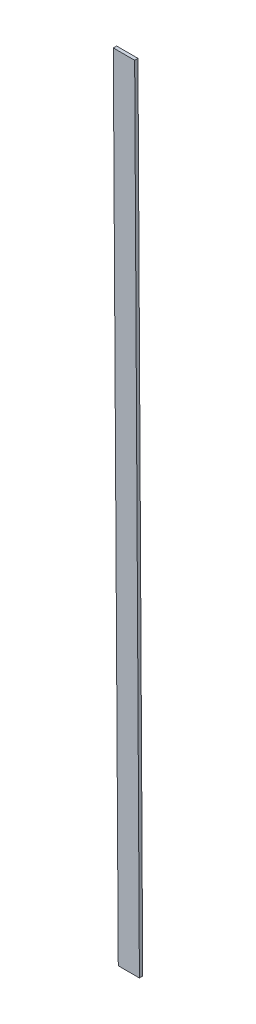
ISO-10303-21;
HEADER;
FILE_DESCRIPTION(('STEP AP214'),'2;1');
FILE_NAME('part.step','',(''),(''),'','','');
FILE_SCHEMA(('AUTOMOTIVE_DESIGN { 1 0 10303 214 1 1 1 1 }'));
ENDSEC;
DATA;
#1=APPLICATION_CONTEXT('core data for automotive mechanical design processes');
#2=APPLICATION_PROTOCOL_DEFINITION('international standard','automotive_design',2000,#1);
#3=PRODUCT_CONTEXT('',#1,'mechanical');
#4=PRODUCT('Part','Part','',(#3));
#5=PRODUCT_RELATED_PRODUCT_CATEGORY('part','',(#4));
#6=PRODUCT_DEFINITION_FORMATION('','',#4);
#7=PRODUCT_DEFINITION_CONTEXT('part definition',#1,'design');
#8=PRODUCT_DEFINITION('design','',#6,#7);
#9=PRODUCT_DEFINITION_SHAPE('','',#8);
#10=(LENGTH_UNIT() NAMED_UNIT(*) SI_UNIT(.MILLI.,.METRE.));
#11=(NAMED_UNIT(*) PLANE_ANGLE_UNIT() SI_UNIT($,.RADIAN.));
#12=(NAMED_UNIT(*) SI_UNIT($,.STERADIAN.) SOLID_ANGLE_UNIT());
#13=UNCERTAINTY_MEASURE_WITH_UNIT(LENGTH_MEASURE(1.E-05),#10,'distance_accuracy_value','');
#14=(GEOMETRIC_REPRESENTATION_CONTEXT(3) GLOBAL_UNCERTAINTY_ASSIGNED_CONTEXT((#13)) GLOBAL_UNIT_ASSIGNED_CONTEXT((#10,
#11,#12)) REPRESENTATION_CONTEXT('',''));
#15=CARTESIAN_POINT('',(0.,0.,0.));
#16=DIRECTION('',(0.,0.,1.));
#17=DIRECTION('',(1.,0.,0.));
#18=AXIS2_PLACEMENT_3D('',#15,#16,#17);
#19=CARTESIAN_POINT('',(47.7982863284493,292.660937796031,1.5875));
#20=DIRECTION('',(0.999980312138498,0.00627497692367997,0.));
#21=DIRECTION('',(-0.00627497692367997,0.999980312138498,0.));
#22=AXIS2_PLACEMENT_3D('',#19,#20,#21);
#23=PLANE('',#22);
#24=DIRECTION('',(0.00627497692367997,-0.999980312138498,0.));
#25=VECTOR('',#24,1.);
#26=CARTESIAN_POINT('',(47.7982863284493,292.660937796031,0.));
#27=LINE('',#26,#25);
#28=CARTESIAN_POINT('',(47.7982863284493,292.660937796031,0.));
#29=VERTEX_POINT('',#28);
#30=CARTESIAN_POINT('',(50.18916541799,-88.3495499433026,0.));
#31=VERTEX_POINT('',#30);
#32=EDGE_CURVE('E95',#29,#31,#27,.T.);
#33=ORIENTED_EDGE('',*,*,#32,.T.);
#34=DIRECTION('',(0.,0.,-1.));
#35=VECTOR('',#34,1.);
#36=CARTESIAN_POINT('',(50.18916541799,-88.3495499433026,1.5875));
#37=LINE('',#36,#35);
#38=CARTESIAN_POINT('',(50.18916541799,-88.3495499433026,1.5875));
#39=VERTEX_POINT('',#38);
#40=EDGE_CURVE('E11',#39,#31,#37,.T.);
#41=ORIENTED_EDGE('',*,*,#40,.F.);
#42=DIRECTION('',(0.00627497692367997,-0.999980312138498,0.));
#43=VECTOR('',#42,1.);
#44=CARTESIAN_POINT('',(47.7982863284493,292.660937796031,1.5875));
#45=LINE('',#44,#43);
#46=CARTESIAN_POINT('',(47.7982863284493,292.660937796031,1.5875));
#47=VERTEX_POINT('',#46);
#48=EDGE_CURVE('E83',#47,#39,#45,.T.);
#49=ORIENTED_EDGE('',*,*,#48,.F.);
#50=DIRECTION('',(0.,0.,-1.));
#51=VECTOR('',#50,1.);
#52=CARTESIAN_POINT('',(47.7982863284493,292.660937796031,1.5875));
#53=LINE('',#52,#51);
#54=EDGE_CURVE('E91',#47,#29,#53,.T.);
#55=ORIENTED_EDGE('',*,*,#54,.T.);
#56=EDGE_LOOP('',(#33,#41,#49,#55));
#57=FACE_BOUND('',#56,.T.);
#58=ADVANCED_FACE('F32',(#57),#23,.F.);
#59=CARTESIAN_POINT('',(50.18916541799,-88.3495499433026,1.5875));
#60=DIRECTION('',(0.,1.,0.));
#61=DIRECTION('',(0.,0.,1.));
#62=AXIS2_PLACEMENT_3D('',#59,#60,#61);
#63=PLANE('',#62);
#64=DIRECTION('',(1.,0.,0.));
#65=VECTOR('',#64,1.);
#66=CARTESIAN_POINT('',(50.18916541799,-88.3495499433026,0.));
#67=LINE('',#66,#65);
#68=CARTESIAN_POINT('',(60.34916541799,-88.3495499433026,0.));
#69=VERTEX_POINT('',#68);
#70=EDGE_CURVE('E87',#31,#69,#67,.T.);
#71=ORIENTED_EDGE('',*,*,#70,.T.);
#72=DIRECTION('',(0.,0.,-1.));
#73=VECTOR('',#72,1.);
#74=CARTESIAN_POINT('',(60.34916541799,-88.3495499433026,1.5875));
#75=LINE('',#74,#73);
#76=CARTESIAN_POINT('',(60.34916541799,-88.3495499433026,1.5875));
#77=VERTEX_POINT('',#76);
#78=EDGE_CURVE('E40',#77,#69,#75,.T.);
#79=ORIENTED_EDGE('',*,*,#78,.F.);
#80=DIRECTION('',(1.,0.,0.));
#81=VECTOR('',#80,1.);
#82=CARTESIAN_POINT('',(50.18916541799,-88.3495499433026,1.5875));
#83=LINE('',#82,#81);
#84=EDGE_CURVE('E78',#39,#77,#83,.T.);
#85=ORIENTED_EDGE('',*,*,#84,.F.);
#86=ORIENTED_EDGE('',*,*,#40,.T.);
#87=EDGE_LOOP('',(#71,#79,#85,#86));
#88=FACE_BOUND('',#87,.T.);
#89=ADVANCED_FACE('F86',(#88),#63,.F.);
#90=CARTESIAN_POINT('',(60.34916541799,-88.3495499433026,1.5875));
#91=DIRECTION('',(-0.999982112142968,-0.00598125355502502,0.));
#92=DIRECTION('',(0.00598125355502502,-0.999982112142968,0.));
#93=AXIS2_PLACEMENT_3D('',#90,#91,#92);
#94=PLANE('',#93);
#95=DIRECTION('',(-0.00598125355502502,0.999982112142968,0.));
#96=VECTOR('',#95,1.);
#97=CARTESIAN_POINT('',(60.34916541799,-88.3495499433026,0.));
#98=LINE('',#97,#96);
#99=CARTESIAN_POINT('',(58.070204317967,292.660937796031,0.));
#100=VERTEX_POINT('',#99);
#101=EDGE_CURVE('E65',#69,#100,#98,.T.);
#102=ORIENTED_EDGE('',*,*,#101,.T.);
#103=DIRECTION('',(0.,0.,-1.));
#104=VECTOR('',#103,1.);
#105=CARTESIAN_POINT('',(58.070204317967,292.660937796031,1.5875));
#106=LINE('',#105,#104);
#107=CARTESIAN_POINT('',(58.070204317967,292.660937796031,1.5875));
#108=VERTEX_POINT('',#107);
#109=EDGE_CURVE('E88',#108,#100,#106,.T.);
#110=ORIENTED_EDGE('',*,*,#109,.F.);
#111=DIRECTION('',(-0.00598125355502502,0.999982112142968,0.));
#112=VECTOR('',#111,1.);
#113=CARTESIAN_POINT('',(60.34916541799,-88.3495499433026,1.5875));
#114=LINE('',#113,#112);
#115=EDGE_CURVE('E81',#77,#108,#114,.T.);
#116=ORIENTED_EDGE('',*,*,#115,.F.);
#117=ORIENTED_EDGE('',*,*,#78,.T.);
#118=EDGE_LOOP('',(#102,#110,#116,#117));
#119=FACE_BOUND('',#118,.T.);
#120=ADVANCED_FACE('F89',(#119),#94,.F.);
#121=CARTESIAN_POINT('',(58.070204317967,292.660937796031,1.5875));
#122=DIRECTION('',(0.,-1.,0.));
#123=DIRECTION('',(0.,0.,-1.));
#124=AXIS2_PLACEMENT_3D('',#121,#122,#123);
#125=PLANE('',#124);
#126=DIRECTION('',(-1.,0.,0.));
#127=VECTOR('',#126,1.);
#128=CARTESIAN_POINT('',(58.070204317967,292.660937796031,0.));
#129=LINE('',#128,#127);
#130=EDGE_CURVE('E71',#100,#29,#129,.T.);
#131=ORIENTED_EDGE('',*,*,#130,.T.);
#132=ORIENTED_EDGE('',*,*,#54,.F.);
#133=DIRECTION('',(-1.,0.,0.));
#134=VECTOR('',#133,1.);
#135=CARTESIAN_POINT('',(58.070204317967,292.660937796031,1.5875));
#136=LINE('',#135,#134);
#137=EDGE_CURVE('E48',#108,#47,#136,.T.);
#138=ORIENTED_EDGE('',*,*,#137,.F.);
#139=ORIENTED_EDGE('',*,*,#109,.T.);
#140=EDGE_LOOP('',(#131,#132,#138,#139));
#141=FACE_BOUND('',#140,.T.);
#142=ADVANCED_FACE('F102',(#141),#125,.F.);
#143=CARTESIAN_POINT('',(0.,0.,1.5875));
#144=DIRECTION('',(0.,0.,1.));
#145=DIRECTION('',(1.,0.,0.));
#146=AXIS2_PLACEMENT_3D('',#143,#144,#145);
#147=PLANE('',#146);
#148=ORIENTED_EDGE('',*,*,#48,.T.);
#149=ORIENTED_EDGE('',*,*,#84,.T.);
#150=ORIENTED_EDGE('',*,*,#115,.T.);
#151=ORIENTED_EDGE('',*,*,#137,.T.);
#152=EDGE_LOOP('',(#148,#149,#150,#151));
#153=FACE_BOUND('',#152,.T.);
#154=ADVANCED_FACE('F79',(#153),#147,.T.);
#155=CARTESIAN_POINT('',(0.,0.,0.));
#156=DIRECTION('',(0.,0.,1.));
#157=DIRECTION('',(1.,0.,0.));
#158=AXIS2_PLACEMENT_3D('',#155,#156,#157);
#159=PLANE('',#158);
#160=ORIENTED_EDGE('',*,*,#32,.F.);
#161=ORIENTED_EDGE('',*,*,#130,.F.);
#162=ORIENTED_EDGE('',*,*,#101,.F.);
#163=ORIENTED_EDGE('',*,*,#70,.F.);
#164=EDGE_LOOP('',(#160,#161,#162,#163));
#165=FACE_BOUND('',#164,.T.);
#166=ADVANCED_FACE('F105',(#165),#159,.F.);
#167=CLOSED_SHELL('',(#58,#89,#120,#142,#154,#166));
#168=MANIFOLD_SOLID_BREP('B2',#167);
#169=ADVANCED_BREP_SHAPE_REPRESENTATION('',(#18,#168),#14);
#170=SHAPE_DEFINITION_REPRESENTATION(#9,#169);
ENDSEC;
END-ISO-10303-21;
